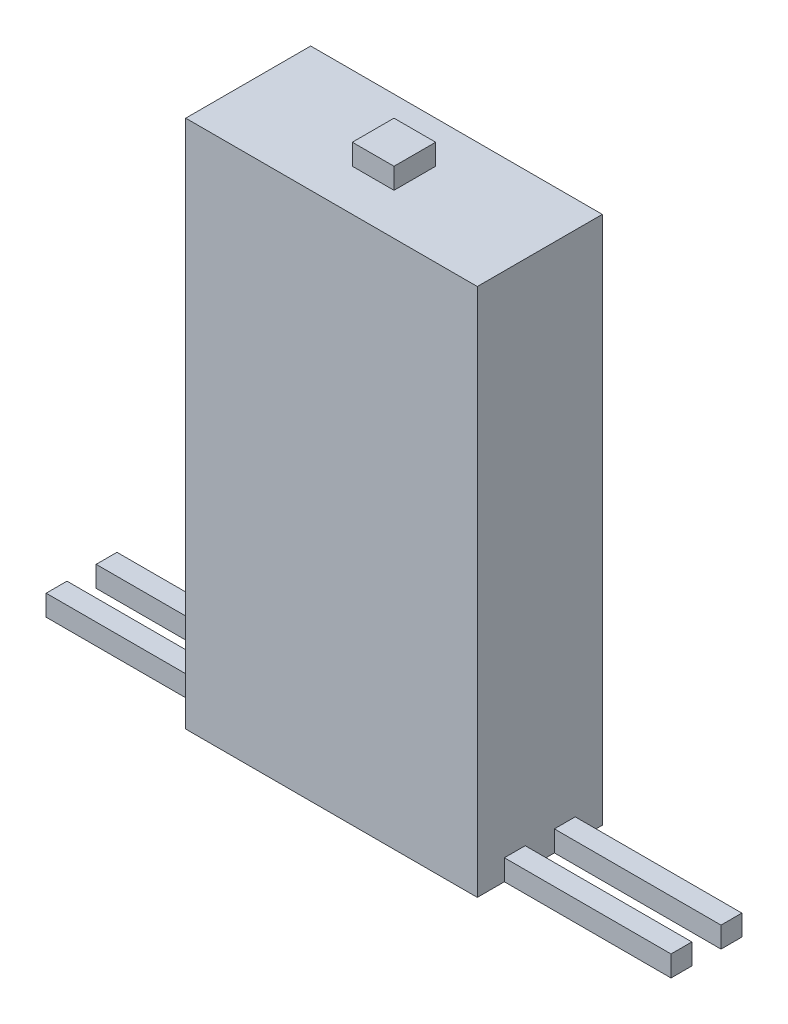
ISO-10303-21;
HEADER;
FILE_DESCRIPTION(('STEP AP214'),'2;1');
FILE_NAME('part.step','',(''),(''),'','','');
FILE_SCHEMA(('AUTOMOTIVE_DESIGN { 1 0 10303 214 1 1 1 1 }'));
ENDSEC;
DATA;
#1=APPLICATION_CONTEXT('core data for automotive mechanical design processes');
#2=APPLICATION_PROTOCOL_DEFINITION('international standard','automotive_design',2000,#1);
#3=PRODUCT_CONTEXT('',#1,'mechanical');
#4=PRODUCT('Part','Part','',(#3));
#5=PRODUCT_RELATED_PRODUCT_CATEGORY('part','',(#4));
#6=PRODUCT_DEFINITION_FORMATION('','',#4);
#7=PRODUCT_DEFINITION_CONTEXT('part definition',#1,'design');
#8=PRODUCT_DEFINITION('design','',#6,#7);
#9=PRODUCT_DEFINITION_SHAPE('','',#8);
#10=(LENGTH_UNIT() NAMED_UNIT(*) SI_UNIT(.MILLI.,.METRE.));
#11=(NAMED_UNIT(*) PLANE_ANGLE_UNIT() SI_UNIT($,.RADIAN.));
#12=(NAMED_UNIT(*) SI_UNIT($,.STERADIAN.) SOLID_ANGLE_UNIT());
#13=UNCERTAINTY_MEASURE_WITH_UNIT(LENGTH_MEASURE(1.E-05),#10,'distance_accuracy_value','');
#14=(GEOMETRIC_REPRESENTATION_CONTEXT(3) GLOBAL_UNCERTAINTY_ASSIGNED_CONTEXT((#13)) GLOBAL_UNIT_ASSIGNED_CONTEXT((#10,
#11,#12)) REPRESENTATION_CONTEXT('',''));
#15=CARTESIAN_POINT('',(0.,0.,0.));
#16=DIRECTION('',(0.,0.,1.));
#17=DIRECTION('',(1.,0.,0.));
#18=AXIS2_PLACEMENT_3D('',#15,#16,#17);
#19=CARTESIAN_POINT('',(0.,127.,0.));
#20=DIRECTION('',(0.,-1.,0.));
#21=DIRECTION('',(0.,0.,-1.));
#22=AXIS2_PLACEMENT_3D('',#19,#20,#21);
#23=PLANE('',#22);
#24=DIRECTION('',(0.,0.,-1.));
#25=VECTOR('',#24,1.);
#26=CARTESIAN_POINT('',(35.,127.,15.));
#27=LINE('',#26,#25);
#28=CARTESIAN_POINT('',(35.,127.,15.));
#29=VERTEX_POINT('',#28);
#30=CARTESIAN_POINT('',(35.,127.,-15.));
#31=VERTEX_POINT('',#30);
#32=EDGE_CURVE('E402',#29,#31,#27,.T.);
#33=ORIENTED_EDGE('',*,*,#32,.T.);
#34=DIRECTION('',(-1.,0.,0.));
#35=VECTOR('',#34,1.);
#36=CARTESIAN_POINT('',(-35.,127.,-15.));
#37=LINE('',#36,#35);
#38=CARTESIAN_POINT('',(-35.,127.,-15.));
#39=VERTEX_POINT('',#38);
#40=EDGE_CURVE('E406',#31,#39,#37,.T.);
#41=ORIENTED_EDGE('',*,*,#40,.T.);
#42=DIRECTION('',(0.,0.,1.));
#43=VECTOR('',#42,1.);
#44=CARTESIAN_POINT('',(-35.,127.,15.));
#45=LINE('',#44,#43);
#46=CARTESIAN_POINT('',(-35.,127.,15.));
#47=VERTEX_POINT('',#46);
#48=EDGE_CURVE('E410',#39,#47,#45,.T.);
#49=ORIENTED_EDGE('',*,*,#48,.T.);
#50=DIRECTION('',(1.,0.,0.));
#51=VECTOR('',#50,1.);
#52=CARTESIAN_POINT('',(-35.,127.,15.));
#53=LINE('',#52,#51);
#54=EDGE_CURVE('E413',#47,#29,#53,.T.);
#55=ORIENTED_EDGE('',*,*,#54,.T.);
#56=EDGE_LOOP('',(#33,#41,#49,#55));
#57=FACE_BOUND('',#56,.T.);
#58=DIRECTION('',(0.,0.,-1.));
#59=VECTOR('',#58,1.);
#60=CARTESIAN_POINT('',(5.,127.,5.));
#61=LINE('',#60,#59);
#62=CARTESIAN_POINT('',(5.,127.,5.));
#63=VERTEX_POINT('',#62);
#64=CARTESIAN_POINT('',(5.,127.,-5.));
#65=VERTEX_POINT('',#64);
#66=EDGE_CURVE('E229',#63,#65,#61,.T.);
#67=ORIENTED_EDGE('',*,*,#66,.F.);
#68=DIRECTION('',(1.,0.,0.));
#69=VECTOR('',#68,1.);
#70=CARTESIAN_POINT('',(-5.,127.,5.));
#71=LINE('',#70,#69);
#72=CARTESIAN_POINT('',(-5.,127.,5.));
#73=VERTEX_POINT('',#72);
#74=EDGE_CURVE('E226',#73,#63,#71,.T.);
#75=ORIENTED_EDGE('',*,*,#74,.F.);
#76=DIRECTION('',(0.,0.,1.));
#77=VECTOR('',#76,1.);
#78=CARTESIAN_POINT('',(-5.,127.,5.));
#79=LINE('',#78,#77);
#80=CARTESIAN_POINT('',(-5.,127.,-5.));
#81=VERTEX_POINT('',#80);
#82=EDGE_CURVE('E66',#81,#73,#79,.T.);
#83=ORIENTED_EDGE('',*,*,#82,.F.);
#84=DIRECTION('',(-1.,0.,0.));
#85=VECTOR('',#84,1.);
#86=CARTESIAN_POINT('',(-5.,127.,-5.));
#87=LINE('',#86,#85);
#88=EDGE_CURVE('E61',#65,#81,#87,.T.);
#89=ORIENTED_EDGE('',*,*,#88,.F.);
#90=EDGE_LOOP('',(#67,#75,#83,#89));
#91=FACE_BOUND('',#90,.T.);
#92=ADVANCED_FACE('F45',(#57,#91),#23,.F.);
#93=CARTESIAN_POINT('',(-35.,127.,15.));
#94=DIRECTION('',(1.,0.,0.));
#95=DIRECTION('',(0.,0.,-1.));
#96=AXIS2_PLACEMENT_3D('',#93,#94,#95);
#97=PLANE('',#96);
#98=DIRECTION('',(0.,1.,0.));
#99=VECTOR('',#98,1.);
#100=CARTESIAN_POINT('',(-35.,5.,-3.5));
#101=LINE('',#100,#99);
#102=CARTESIAN_POINT('',(-35.,0.,-3.5));
#103=VERTEX_POINT('',#102);
#104=CARTESIAN_POINT('',(-35.,5.,-3.5));
#105=VERTEX_POINT('',#104);
#106=EDGE_CURVE('E263',#103,#105,#101,.T.);
#107=ORIENTED_EDGE('',*,*,#106,.F.);
#108=DIRECTION('',(0.,0.,1.));
#109=VECTOR('',#108,1.);
#110=CARTESIAN_POINT('',(-35.,0.,15.));
#111=LINE('',#110,#109);
#112=CARTESIAN_POINT('',(-35.,0.,3.5));
#113=VERTEX_POINT('',#112);
#114=EDGE_CURVE('E428',#103,#113,#111,.T.);
#115=ORIENTED_EDGE('',*,*,#114,.T.);
#116=DIRECTION('',(0.,-1.,0.));
#117=VECTOR('',#116,1.);
#118=CARTESIAN_POINT('',(-35.,5.,3.5));
#119=LINE('',#118,#117);
#120=CARTESIAN_POINT('',(-35.,5.,3.5));
#121=VERTEX_POINT('',#120);
#122=EDGE_CURVE('E267',#121,#113,#119,.T.);
#123=ORIENTED_EDGE('',*,*,#122,.F.);
#124=DIRECTION('',(0.,0.,-1.));
#125=VECTOR('',#124,1.);
#126=CARTESIAN_POINT('',(-35.,5.,3.5));
#127=LINE('',#126,#125);
#128=CARTESIAN_POINT('',(-35.,5.,8.5));
#129=VERTEX_POINT('',#128);
#130=EDGE_CURVE('E284',#129,#121,#127,.T.);
#131=ORIENTED_EDGE('',*,*,#130,.F.);
#132=DIRECTION('',(0.,1.,0.));
#133=VECTOR('',#132,1.);
#134=CARTESIAN_POINT('',(-35.,5.,8.5));
#135=LINE('',#134,#133);
#136=CARTESIAN_POINT('',(-35.,0.,8.5));
#137=VERTEX_POINT('',#136);
#138=EDGE_CURVE('E297',#137,#129,#135,.T.);
#139=ORIENTED_EDGE('',*,*,#138,.F.);
#140=CARTESIAN_POINT('',(-35.,0.,15.));
#141=VERTEX_POINT('',#140);
#142=EDGE_CURVE('E424',#137,#141,#111,.T.);
#143=ORIENTED_EDGE('',*,*,#142,.T.);
#144=DIRECTION('',(0.,-1.,0.));
#145=VECTOR('',#144,1.);
#146=CARTESIAN_POINT('',(-35.,127.,15.));
#147=LINE('',#146,#145);
#148=EDGE_CURVE('E434',#47,#141,#147,.T.);
#149=ORIENTED_EDGE('',*,*,#148,.F.);
#150=ORIENTED_EDGE('',*,*,#48,.F.);
#151=DIRECTION('',(0.,-1.,0.));
#152=VECTOR('',#151,1.);
#153=CARTESIAN_POINT('',(-35.,127.,-15.));
#154=LINE('',#153,#152);
#155=CARTESIAN_POINT('',(-35.,0.,-15.));
#156=VERTEX_POINT('',#155);
#157=EDGE_CURVE('E54',#39,#156,#154,.T.);
#158=ORIENTED_EDGE('',*,*,#157,.T.);
#159=CARTESIAN_POINT('',(-35.,0.,-8.5));
#160=VERTEX_POINT('',#159);
#161=EDGE_CURVE('E425',#156,#160,#111,.T.);
#162=ORIENTED_EDGE('',*,*,#161,.T.);
#163=DIRECTION('',(0.,-1.,0.));
#164=VECTOR('',#163,1.);
#165=CARTESIAN_POINT('',(-35.,5.,-8.5));
#166=LINE('',#165,#164);
#167=CARTESIAN_POINT('',(-35.,4.99999999999999,-8.5));
#168=VERTEX_POINT('',#167);
#169=EDGE_CURVE('E254',#168,#160,#166,.T.);
#170=ORIENTED_EDGE('',*,*,#169,.F.);
#171=DIRECTION('',(0.,0.,-1.));
#172=VECTOR('',#171,1.);
#173=CARTESIAN_POINT('',(-35.,5.,-3.5));
#174=LINE('',#173,#172);
#175=EDGE_CURVE('E258',#105,#168,#174,.T.);
#176=ORIENTED_EDGE('',*,*,#175,.F.);
#177=EDGE_LOOP('',(#107,#115,#123,#131,#139,#143,#149,#150,#158,#162,#170,#176));
#178=FACE_BOUND('',#177,.T.);
#179=ADVANCED_FACE('F444',(#178),#97,.F.);
#180=CARTESIAN_POINT('',(35.,127.,15.));
#181=DIRECTION('',(-1.,0.,0.));
#182=DIRECTION('',(0.,0.,1.));
#183=AXIS2_PLACEMENT_3D('',#180,#181,#182);
#184=PLANE('',#183);
#185=DIRECTION('',(0.,1.,0.));
#186=VECTOR('',#185,1.);
#187=CARTESIAN_POINT('',(35.,5.,3.5));
#188=LINE('',#187,#186);
#189=CARTESIAN_POINT('',(35.,0.,3.5));
#190=VERTEX_POINT('',#189);
#191=CARTESIAN_POINT('',(35.,5.00000000000001,3.5));
#192=VERTEX_POINT('',#191);
#193=EDGE_CURVE('E345',#190,#192,#188,.T.);
#194=ORIENTED_EDGE('',*,*,#193,.F.);
#195=DIRECTION('',(0.,0.,-1.));
#196=VECTOR('',#195,1.);
#197=CARTESIAN_POINT('',(35.,0.,15.));
#198=LINE('',#197,#196);
#199=CARTESIAN_POINT('',(35.,0.,-3.5));
#200=VERTEX_POINT('',#199);
#201=EDGE_CURVE('E421',#190,#200,#198,.T.);
#202=ORIENTED_EDGE('',*,*,#201,.T.);
#203=DIRECTION('',(0.,-1.,0.));
#204=VECTOR('',#203,1.);
#205=CARTESIAN_POINT('',(35.,5.,-3.5));
#206=LINE('',#205,#204);
#207=CARTESIAN_POINT('',(35.,5.,-3.5));
#208=VERTEX_POINT('',#207);
#209=EDGE_CURVE('E349',#208,#200,#206,.T.);
#210=ORIENTED_EDGE('',*,*,#209,.F.);
#211=DIRECTION('',(0.,0.,1.));
#212=VECTOR('',#211,1.);
#213=CARTESIAN_POINT('',(35.,5.,-3.5));
#214=LINE('',#213,#212);
#215=CARTESIAN_POINT('',(35.,5.,-8.5));
#216=VERTEX_POINT('',#215);
#217=EDGE_CURVE('E366',#216,#208,#214,.T.);
#218=ORIENTED_EDGE('',*,*,#217,.F.);
#219=DIRECTION('',(0.,1.,0.));
#220=VECTOR('',#219,1.);
#221=CARTESIAN_POINT('',(35.,5.,-8.5));
#222=LINE('',#221,#220);
#223=CARTESIAN_POINT('',(35.,0.,-8.5));
#224=VERTEX_POINT('',#223);
#225=EDGE_CURVE('E379',#224,#216,#222,.T.);
#226=ORIENTED_EDGE('',*,*,#225,.F.);
#227=CARTESIAN_POINT('',(35.,0.,-15.));
#228=VERTEX_POINT('',#227);
#229=EDGE_CURVE('E401',#224,#228,#198,.T.);
#230=ORIENTED_EDGE('',*,*,#229,.T.);
#231=DIRECTION('',(0.,-1.,0.));
#232=VECTOR('',#231,1.);
#233=CARTESIAN_POINT('',(35.,127.,-15.));
#234=LINE('',#233,#232);
#235=EDGE_CURVE('E11',#31,#228,#234,.T.);
#236=ORIENTED_EDGE('',*,*,#235,.F.);
#237=ORIENTED_EDGE('',*,*,#32,.F.);
#238=DIRECTION('',(0.,-1.,0.));
#239=VECTOR('',#238,1.);
#240=CARTESIAN_POINT('',(35.,127.,15.));
#241=LINE('',#240,#239);
#242=CARTESIAN_POINT('',(35.,0.,15.));
#243=VERTEX_POINT('',#242);
#244=EDGE_CURVE('E416',#29,#243,#241,.T.);
#245=ORIENTED_EDGE('',*,*,#244,.T.);
#246=CARTESIAN_POINT('',(35.,0.,8.5));
#247=VERTEX_POINT('',#246);
#248=EDGE_CURVE('E417',#243,#247,#198,.T.);
#249=ORIENTED_EDGE('',*,*,#248,.T.);
#250=DIRECTION('',(0.,-1.,0.));
#251=VECTOR('',#250,1.);
#252=CARTESIAN_POINT('',(35.,5.,8.5));
#253=LINE('',#252,#251);
#254=CARTESIAN_POINT('',(35.,5.,8.5));
#255=VERTEX_POINT('',#254);
#256=EDGE_CURVE('E336',#255,#247,#253,.T.);
#257=ORIENTED_EDGE('',*,*,#256,.F.);
#258=DIRECTION('',(0.,0.,1.));
#259=VECTOR('',#258,1.);
#260=CARTESIAN_POINT('',(35.,5.,3.5));
#261=LINE('',#260,#259);
#262=EDGE_CURVE('E340',#192,#255,#261,.T.);
#263=ORIENTED_EDGE('',*,*,#262,.F.);
#264=EDGE_LOOP('',(#194,#202,#210,#218,#226,#230,#236,#237,#245,#249,#257,#263));
#265=FACE_BOUND('',#264,.T.);
#266=ADVANCED_FACE('F47',(#265),#184,.F.);
#267=CARTESIAN_POINT('',(-35.,127.,-15.));
#268=DIRECTION('',(0.,0.,1.));
#269=DIRECTION('',(1.,0.,0.));
#270=AXIS2_PLACEMENT_3D('',#267,#268,#269);
#271=PLANE('',#270);
#272=DIRECTION('',(-1.,0.,0.));
#273=VECTOR('',#272,1.);
#274=CARTESIAN_POINT('',(-35.,0.,-15.));
#275=LINE('',#274,#273);
#276=EDGE_CURVE('E420',#228,#156,#275,.T.);
#277=ORIENTED_EDGE('',*,*,#276,.T.);
#278=ORIENTED_EDGE('',*,*,#157,.F.);
#279=ORIENTED_EDGE('',*,*,#40,.F.);
#280=ORIENTED_EDGE('',*,*,#235,.T.);
#281=EDGE_LOOP('',(#277,#278,#279,#280));
#282=FACE_BOUND('',#281,.T.);
#283=ADVANCED_FACE('F529',(#282),#271,.F.);
#284=CARTESIAN_POINT('',(-35.,127.,15.));
#285=DIRECTION('',(0.,0.,-1.));
#286=DIRECTION('',(-1.,0.,0.));
#287=AXIS2_PLACEMENT_3D('',#284,#285,#286);
#288=PLANE('',#287);
#289=DIRECTION('',(1.,0.,0.));
#290=VECTOR('',#289,1.);
#291=CARTESIAN_POINT('',(-35.,0.,15.));
#292=LINE('',#291,#290);
#293=EDGE_CURVE('E407',#141,#243,#292,.T.);
#294=ORIENTED_EDGE('',*,*,#293,.T.);
#295=ORIENTED_EDGE('',*,*,#244,.F.);
#296=ORIENTED_EDGE('',*,*,#54,.F.);
#297=ORIENTED_EDGE('',*,*,#148,.T.);
#298=EDGE_LOOP('',(#294,#295,#296,#297));
#299=FACE_BOUND('',#298,.T.);
#300=ADVANCED_FACE('F526',(#299),#288,.F.);
#301=CARTESIAN_POINT('',(0.,0.,0.));
#302=DIRECTION('',(0.,-1.,0.));
#303=DIRECTION('',(0.,0.,-1.));
#304=AXIS2_PLACEMENT_3D('',#301,#302,#303);
#305=PLANE('',#304);
#306=CARTESIAN_POINT('',(0.,0.,0.));
#307=DIRECTION('',(0.,-1.,0.));
#308=DIRECTION('',(0.,0.,-1.));
#309=AXIS2_PLACEMENT_3D('',#306,#307,#308);
#310=CIRCLE('',#309,6.);
#311=CARTESIAN_POINT('',(0.,0.,-6.));
#312=VERTEX_POINT('',#311);
#313=EDGE_CURVE('E606',#312,#312,#310,.T.);
#314=ORIENTED_EDGE('',*,*,#313,.F.);
#315=EDGE_LOOP('',(#314));
#316=FACE_BOUND('',#315,.T.);
#317=ORIENTED_EDGE('',*,*,#248,.F.);
#318=ORIENTED_EDGE('',*,*,#293,.F.);
#319=ORIENTED_EDGE('',*,*,#142,.F.);
#320=DIRECTION('',(1.,0.,0.));
#321=VECTOR('',#320,1.);
#322=CARTESIAN_POINT('',(-75.,0.,8.5));
#323=LINE('',#322,#321);
#324=CARTESIAN_POINT('',(-75.,0.,8.5));
#325=VERTEX_POINT('',#324);
#326=EDGE_CURVE('E311',#325,#137,#323,.T.);
#327=ORIENTED_EDGE('',*,*,#326,.F.);
#328=DIRECTION('',(0.,0.,1.));
#329=VECTOR('',#328,1.);
#330=CARTESIAN_POINT('',(-75.,0.,3.5));
#331=LINE('',#330,#329);
#332=CARTESIAN_POINT('',(-75.,0.,3.5));
#333=VERTEX_POINT('',#332);
#334=EDGE_CURVE('E283',#333,#325,#331,.T.);
#335=ORIENTED_EDGE('',*,*,#334,.F.);
#336=DIRECTION('',(1.,0.,0.));
#337=VECTOR('',#336,1.);
#338=CARTESIAN_POINT('',(-75.,0.,3.5));
#339=LINE('',#338,#337);
#340=EDGE_CURVE('E315',#333,#113,#339,.T.);
#341=ORIENTED_EDGE('',*,*,#340,.T.);
#342=ORIENTED_EDGE('',*,*,#114,.F.);
#343=DIRECTION('',(1.,0.,0.));
#344=VECTOR('',#343,1.);
#345=CARTESIAN_POINT('',(-75.,0.,-3.5));
#346=LINE('',#345,#344);
#347=CARTESIAN_POINT('',(-75.,0.,-3.5));
#348=VERTEX_POINT('',#347);
#349=EDGE_CURVE('E231',#348,#103,#346,.T.);
#350=ORIENTED_EDGE('',*,*,#349,.F.);
#351=DIRECTION('',(0.,0.,1.));
#352=VECTOR('',#351,1.);
#353=CARTESIAN_POINT('',(-75.,0.,-3.5));
#354=LINE('',#353,#352);
#355=CARTESIAN_POINT('',(-75.,0.,-8.5));
#356=VERTEX_POINT('',#355);
#357=EDGE_CURVE('E259',#356,#348,#354,.T.);
#358=ORIENTED_EDGE('',*,*,#357,.F.);
#359=DIRECTION('',(1.,0.,0.));
#360=VECTOR('',#359,1.);
#361=CARTESIAN_POINT('',(-75.,0.,-8.5));
#362=LINE('',#361,#360);
#363=EDGE_CURVE('E249',#356,#160,#362,.T.);
#364=ORIENTED_EDGE('',*,*,#363,.T.);
#365=ORIENTED_EDGE('',*,*,#161,.F.);
#366=ORIENTED_EDGE('',*,*,#276,.F.);
#367=ORIENTED_EDGE('',*,*,#229,.F.);
#368=DIRECTION('',(-1.,0.,0.));
#369=VECTOR('',#368,1.);
#370=CARTESIAN_POINT('',(75.,0.,-8.5));
#371=LINE('',#370,#369);
#372=CARTESIAN_POINT('',(75.,0.,-8.5));
#373=VERTEX_POINT('',#372);
#374=EDGE_CURVE('E393',#373,#224,#371,.T.);
#375=ORIENTED_EDGE('',*,*,#374,.F.);
#376=DIRECTION('',(0.,0.,-1.));
#377=VECTOR('',#376,1.);
#378=CARTESIAN_POINT('',(75.,0.,-3.5));
#379=LINE('',#378,#377);
#380=CARTESIAN_POINT('',(75.,0.,-3.5));
#381=VERTEX_POINT('',#380);
#382=EDGE_CURVE('E365',#381,#373,#379,.T.);
#383=ORIENTED_EDGE('',*,*,#382,.F.);
#384=DIRECTION('',(-1.,0.,0.));
#385=VECTOR('',#384,1.);
#386=CARTESIAN_POINT('',(75.,0.,-3.5));
#387=LINE('',#386,#385);
#388=EDGE_CURVE('E397',#381,#200,#387,.T.);
#389=ORIENTED_EDGE('',*,*,#388,.T.);
#390=ORIENTED_EDGE('',*,*,#201,.F.);
#391=DIRECTION('',(-1.,0.,0.));
#392=VECTOR('',#391,1.);
#393=CARTESIAN_POINT('',(75.,0.,3.5));
#394=LINE('',#393,#392);
#395=CARTESIAN_POINT('',(75.,0.,3.5));
#396=VERTEX_POINT('',#395);
#397=EDGE_CURVE('E319',#396,#190,#394,.T.);
#398=ORIENTED_EDGE('',*,*,#397,.F.);
#399=DIRECTION('',(0.,0.,-1.));
#400=VECTOR('',#399,1.);
#401=CARTESIAN_POINT('',(75.,0.,3.5));
#402=LINE('',#401,#400);
#403=CARTESIAN_POINT('',(75.,0.,8.5));
#404=VERTEX_POINT('',#403);
#405=EDGE_CURVE('E341',#404,#396,#402,.T.);
#406=ORIENTED_EDGE('',*,*,#405,.F.);
#407=DIRECTION('',(-1.,0.,0.));
#408=VECTOR('',#407,1.);
#409=CARTESIAN_POINT('',(75.,0.,8.5));
#410=LINE('',#409,#408);
#411=EDGE_CURVE('E331',#404,#247,#410,.T.);
#412=ORIENTED_EDGE('',*,*,#411,.T.);
#413=EDGE_LOOP('',(#317,#318,#319,#327,#335,#341,#342,#350,#358,#364,#365,#366,#367,#375,#383,
#389,#390,#398,#406,#412));
#414=FACE_BOUND('',#413,.T.);
#415=ADVANCED_FACE('F450',(#316,#414),#305,.T.);
#416=CARTESIAN_POINT('',(75.,5.,-3.5));
#417=DIRECTION('',(0.,0.,-1.));
#418=DIRECTION('',(-1.,0.,0.));
#419=AXIS2_PLACEMENT_3D('',#416,#417,#418);
#420=PLANE('',#419);
#421=ORIENTED_EDGE('',*,*,#209,.T.);
#422=ORIENTED_EDGE('',*,*,#388,.F.);
#423=DIRECTION('',(0.,-1.,0.));
#424=VECTOR('',#423,1.);
#425=CARTESIAN_POINT('',(75.,5.,-3.5));
#426=LINE('',#425,#424);
#427=CARTESIAN_POINT('',(75.,5.,-3.5));
#428=VERTEX_POINT('',#427);
#429=EDGE_CURVE('E361',#428,#381,#426,.T.);
#430=ORIENTED_EDGE('',*,*,#429,.F.);
#431=DIRECTION('',(-1.,0.,0.));
#432=VECTOR('',#431,1.);
#433=CARTESIAN_POINT('',(75.,5.,-3.5));
#434=LINE('',#433,#432);
#435=EDGE_CURVE('E375',#428,#208,#434,.T.);
#436=ORIENTED_EDGE('',*,*,#435,.T.);
#437=EDGE_LOOP('',(#421,#422,#430,#436));
#438=FACE_BOUND('',#437,.T.);
#439=ADVANCED_FACE('F501',(#438),#420,.F.);
#440=CARTESIAN_POINT('',(75.,5.,-8.5));
#441=DIRECTION('',(0.,0.,1.));
#442=DIRECTION('',(0.,-1.,0.));
#443=AXIS2_PLACEMENT_3D('',#440,#441,#442);
#444=PLANE('',#443);
#445=ORIENTED_EDGE('',*,*,#225,.T.);
#446=DIRECTION('',(-1.,0.,0.));
#447=VECTOR('',#446,1.);
#448=CARTESIAN_POINT('',(75.,5.,-8.5));
#449=LINE('',#448,#447);
#450=CARTESIAN_POINT('',(75.,5.,-8.5));
#451=VERTEX_POINT('',#450);
#452=EDGE_CURVE('E389',#451,#216,#449,.T.);
#453=ORIENTED_EDGE('',*,*,#452,.F.);
#454=DIRECTION('',(0.,1.,0.));
#455=VECTOR('',#454,1.);
#456=CARTESIAN_POINT('',(75.,5.,-8.5));
#457=LINE('',#456,#455);
#458=EDGE_CURVE('E369',#373,#451,#457,.T.);
#459=ORIENTED_EDGE('',*,*,#458,.F.);
#460=ORIENTED_EDGE('',*,*,#374,.T.);
#461=EDGE_LOOP('',(#445,#453,#459,#460));
#462=FACE_BOUND('',#461,.T.);
#463=ADVANCED_FACE('F491',(#462),#444,.F.);
#464=CARTESIAN_POINT('',(75.,5.,-3.5));
#465=DIRECTION('',(0.,-1.,0.));
#466=DIRECTION('',(0.,0.,-1.));
#467=AXIS2_PLACEMENT_3D('',#464,#465,#466);
#468=PLANE('',#467);
#469=ORIENTED_EDGE('',*,*,#217,.T.);
#470=ORIENTED_EDGE('',*,*,#435,.F.);
#471=DIRECTION('',(0.,0.,1.));
#472=VECTOR('',#471,1.);
#473=CARTESIAN_POINT('',(75.,5.,-3.5));
#474=LINE('',#473,#472);
#475=EDGE_CURVE('E372',#451,#428,#474,.T.);
#476=ORIENTED_EDGE('',*,*,#475,.F.);
#477=ORIENTED_EDGE('',*,*,#452,.T.);
#478=EDGE_LOOP('',(#469,#470,#476,#477));
#479=FACE_BOUND('',#478,.T.);
#480=ADVANCED_FACE('F503',(#479),#468,.F.);
#481=CARTESIAN_POINT('',(75.,0.,0.));
#482=DIRECTION('',(1.,0.,0.));
#483=DIRECTION('',(0.,0.,-1.));
#484=AXIS2_PLACEMENT_3D('',#481,#482,#483);
#485=PLANE('',#484);
#486=ORIENTED_EDGE('',*,*,#429,.T.);
#487=ORIENTED_EDGE('',*,*,#382,.T.);
#488=ORIENTED_EDGE('',*,*,#458,.T.);
#489=ORIENTED_EDGE('',*,*,#475,.T.);
#490=EDGE_LOOP('',(#486,#487,#488,#489));
#491=FACE_BOUND('',#490,.T.);
#492=ADVANCED_FACE('F495',(#491),#485,.T.);
#493=CARTESIAN_POINT('',(75.,5.,3.5));
#494=DIRECTION('',(0.,0.,1.));
#495=DIRECTION('',(1.,0.,0.));
#496=AXIS2_PLACEMENT_3D('',#493,#494,#495);
#497=PLANE('',#496);
#498=ORIENTED_EDGE('',*,*,#193,.T.);
#499=DIRECTION('',(-1.,0.,0.));
#500=VECTOR('',#499,1.);
#501=CARTESIAN_POINT('',(75.,5.,3.5));
#502=LINE('',#501,#500);
#503=CARTESIAN_POINT('',(75.,5.,3.5));
#504=VERTEX_POINT('',#503);
#505=EDGE_CURVE('E323',#504,#192,#502,.T.);
#506=ORIENTED_EDGE('',*,*,#505,.F.);
#507=DIRECTION('',(0.,1.,0.));
#508=VECTOR('',#507,1.);
#509=CARTESIAN_POINT('',(75.,5.,3.5));
#510=LINE('',#509,#508);
#511=EDGE_CURVE('E355',#396,#504,#510,.T.);
#512=ORIENTED_EDGE('',*,*,#511,.F.);
#513=ORIENTED_EDGE('',*,*,#397,.T.);
#514=EDGE_LOOP('',(#498,#506,#512,#513));
#515=FACE_BOUND('',#514,.T.);
#516=ADVANCED_FACE('F510',(#515),#497,.F.);
#517=CARTESIAN_POINT('',(75.,5.,3.5));
#518=DIRECTION('',(0.,-1.,0.));
#519=DIRECTION('',(0.,0.,-1.));
#520=AXIS2_PLACEMENT_3D('',#517,#518,#519);
#521=PLANE('',#520);
#522=ORIENTED_EDGE('',*,*,#262,.T.);
#523=DIRECTION('',(-1.,0.,0.));
#524=VECTOR('',#523,1.);
#525=CARTESIAN_POINT('',(75.,5.,8.5));
#526=LINE('',#525,#524);
#527=CARTESIAN_POINT('',(75.,5.,8.5));
#528=VERTEX_POINT('',#527);
#529=EDGE_CURVE('E327',#528,#255,#526,.T.);
#530=ORIENTED_EDGE('',*,*,#529,.F.);
#531=DIRECTION('',(0.,0.,1.));
#532=VECTOR('',#531,1.);
#533=CARTESIAN_POINT('',(75.,5.,3.5));
#534=LINE('',#533,#532);
#535=EDGE_CURVE('E352',#504,#528,#534,.T.);
#536=ORIENTED_EDGE('',*,*,#535,.F.);
#537=ORIENTED_EDGE('',*,*,#505,.T.);
#538=EDGE_LOOP('',(#522,#530,#536,#537));
#539=FACE_BOUND('',#538,.T.);
#540=ADVANCED_FACE('F544',(#539),#521,.F.);
#541=CARTESIAN_POINT('',(75.,5.,8.5));
#542=DIRECTION('',(0.,0.,-1.));
#543=DIRECTION('',(0.,1.,0.));
#544=AXIS2_PLACEMENT_3D('',#541,#542,#543);
#545=PLANE('',#544);
#546=ORIENTED_EDGE('',*,*,#256,.T.);
#547=ORIENTED_EDGE('',*,*,#411,.F.);
#548=DIRECTION('',(0.,-1.,0.));
#549=VECTOR('',#548,1.);
#550=CARTESIAN_POINT('',(75.,5.,8.5));
#551=LINE('',#550,#549);
#552=EDGE_CURVE('E335',#528,#404,#551,.T.);
#553=ORIENTED_EDGE('',*,*,#552,.F.);
#554=ORIENTED_EDGE('',*,*,#529,.T.);
#555=EDGE_LOOP('',(#546,#547,#553,#554));
#556=FACE_BOUND('',#555,.T.);
#557=ADVANCED_FACE('F541',(#556),#545,.F.);
#558=CARTESIAN_POINT('',(75.,0.,0.));
#559=DIRECTION('',(1.,0.,0.));
#560=DIRECTION('',(0.,0.,-1.));
#561=AXIS2_PLACEMENT_3D('',#558,#559,#560);
#562=PLANE('',#561);
#563=ORIENTED_EDGE('',*,*,#405,.T.);
#564=ORIENTED_EDGE('',*,*,#511,.T.);
#565=ORIENTED_EDGE('',*,*,#535,.T.);
#566=ORIENTED_EDGE('',*,*,#552,.T.);
#567=EDGE_LOOP('',(#563,#564,#565,#566));
#568=FACE_BOUND('',#567,.T.);
#569=ADVANCED_FACE('F549',(#568),#562,.T.);
#570=CARTESIAN_POINT('',(-75.,5.,3.5));
#571=DIRECTION('',(0.,0.,1.));
#572=DIRECTION('',(1.,0.,0.));
#573=AXIS2_PLACEMENT_3D('',#570,#571,#572);
#574=PLANE('',#573);
#575=ORIENTED_EDGE('',*,*,#122,.T.);
#576=ORIENTED_EDGE('',*,*,#340,.F.);
#577=DIRECTION('',(0.,-1.,0.));
#578=VECTOR('',#577,1.);
#579=CARTESIAN_POINT('',(-75.,5.,3.5));
#580=LINE('',#579,#578);
#581=CARTESIAN_POINT('',(-75.,5.,3.5));
#582=VERTEX_POINT('',#581);
#583=EDGE_CURVE('E279',#582,#333,#580,.T.);
#584=ORIENTED_EDGE('',*,*,#583,.F.);
#585=DIRECTION('',(1.,0.,0.));
#586=VECTOR('',#585,1.);
#587=CARTESIAN_POINT('',(-75.,5.,3.5));
#588=LINE('',#587,#586);
#589=EDGE_CURVE('E293',#582,#121,#588,.T.);
#590=ORIENTED_EDGE('',*,*,#589,.T.);
#591=EDGE_LOOP('',(#575,#576,#584,#590));
#592=FACE_BOUND('',#591,.T.);
#593=ADVANCED_FACE('F470',(#592),#574,.F.);
#594=CARTESIAN_POINT('',(-75.,5.,8.5));
#595=DIRECTION('',(0.,0.,-1.));
#596=DIRECTION('',(-1.,0.,0.));
#597=AXIS2_PLACEMENT_3D('',#594,#595,#596);
#598=PLANE('',#597);
#599=ORIENTED_EDGE('',*,*,#138,.T.);
#600=DIRECTION('',(1.,0.,0.));
#601=VECTOR('',#600,1.);
#602=CARTESIAN_POINT('',(-75.,5.,8.5));
#603=LINE('',#602,#601);
#604=CARTESIAN_POINT('',(-75.,5.,8.5));
#605=VERTEX_POINT('',#604);
#606=EDGE_CURVE('E307',#605,#129,#603,.T.);
#607=ORIENTED_EDGE('',*,*,#606,.F.);
#608=DIRECTION('',(0.,1.,0.));
#609=VECTOR('',#608,1.);
#610=CARTESIAN_POINT('',(-75.,5.,8.5));
#611=LINE('',#610,#609);
#612=EDGE_CURVE('E287',#325,#605,#611,.T.);
#613=ORIENTED_EDGE('',*,*,#612,.F.);
#614=ORIENTED_EDGE('',*,*,#326,.T.);
#615=EDGE_LOOP('',(#599,#607,#613,#614));
#616=FACE_BOUND('',#615,.T.);
#617=ADVANCED_FACE('F478',(#616),#598,.F.);
#618=CARTESIAN_POINT('',(-75.,5.,3.5));
#619=DIRECTION('',(0.,-1.,0.));
#620=DIRECTION('',(0.,0.,-1.));
#621=AXIS2_PLACEMENT_3D('',#618,#619,#620);
#622=PLANE('',#621);
#623=ORIENTED_EDGE('',*,*,#130,.T.);
#624=ORIENTED_EDGE('',*,*,#589,.F.);
#625=DIRECTION('',(0.,0.,-1.));
#626=VECTOR('',#625,1.);
#627=CARTESIAN_POINT('',(-75.,5.,3.5));
#628=LINE('',#627,#626);
#629=EDGE_CURVE('E290',#605,#582,#628,.T.);
#630=ORIENTED_EDGE('',*,*,#629,.F.);
#631=ORIENTED_EDGE('',*,*,#606,.T.);
#632=EDGE_LOOP('',(#623,#624,#630,#631));
#633=FACE_BOUND('',#632,.T.);
#634=ADVANCED_FACE('F474',(#633),#622,.F.);
#635=CARTESIAN_POINT('',(-75.,0.,0.));
#636=DIRECTION('',(-1.,0.,0.));
#637=DIRECTION('',(0.,0.,1.));
#638=AXIS2_PLACEMENT_3D('',#635,#636,#637);
#639=PLANE('',#638);
#640=ORIENTED_EDGE('',*,*,#583,.T.);
#641=ORIENTED_EDGE('',*,*,#334,.T.);
#642=ORIENTED_EDGE('',*,*,#612,.T.);
#643=ORIENTED_EDGE('',*,*,#629,.T.);
#644=EDGE_LOOP('',(#640,#641,#642,#643));
#645=FACE_BOUND('',#644,.T.);
#646=ADVANCED_FACE('F567',(#645),#639,.T.);
#647=CARTESIAN_POINT('',(-75.,5.,-3.5));
#648=DIRECTION('',(0.,0.,-1.));
#649=DIRECTION('',(-1.,0.,0.));
#650=AXIS2_PLACEMENT_3D('',#647,#648,#649);
#651=PLANE('',#650);
#652=ORIENTED_EDGE('',*,*,#106,.T.);
#653=DIRECTION('',(1.,0.,0.));
#654=VECTOR('',#653,1.);
#655=CARTESIAN_POINT('',(-75.,5.,-3.5));
#656=LINE('',#655,#654);
#657=CARTESIAN_POINT('',(-75.,5.,-3.5));
#658=VERTEX_POINT('',#657);
#659=EDGE_CURVE('E236',#658,#105,#656,.T.);
#660=ORIENTED_EDGE('',*,*,#659,.F.);
#661=DIRECTION('',(0.,1.,0.));
#662=VECTOR('',#661,1.);
#663=CARTESIAN_POINT('',(-75.,5.,-3.5));
#664=LINE('',#663,#662);
#665=EDGE_CURVE('E273',#348,#658,#664,.T.);
#666=ORIENTED_EDGE('',*,*,#665,.F.);
#667=ORIENTED_EDGE('',*,*,#349,.T.);
#668=EDGE_LOOP('',(#652,#660,#666,#667));
#669=FACE_BOUND('',#668,.T.);
#670=ADVANCED_FACE('F464',(#669),#651,.F.);
#671=CARTESIAN_POINT('',(-75.,5.,-3.5));
#672=DIRECTION('',(0.,-1.,0.));
#673=DIRECTION('',(0.,0.,-1.));
#674=AXIS2_PLACEMENT_3D('',#671,#672,#673);
#675=PLANE('',#674);
#676=ORIENTED_EDGE('',*,*,#175,.T.);
#677=DIRECTION('',(1.,0.,0.));
#678=VECTOR('',#677,1.);
#679=CARTESIAN_POINT('',(-75.,5.,-8.5));
#680=LINE('',#679,#678);
#681=CARTESIAN_POINT('',(-75.,5.,-8.5));
#682=VERTEX_POINT('',#681);
#683=EDGE_CURVE('E245',#682,#168,#680,.T.);
#684=ORIENTED_EDGE('',*,*,#683,.F.);
#685=DIRECTION('',(0.,0.,-1.));
#686=VECTOR('',#685,1.);
#687=CARTESIAN_POINT('',(-75.,5.,-3.5));
#688=LINE('',#687,#686);
#689=EDGE_CURVE('E270',#658,#682,#688,.T.);
#690=ORIENTED_EDGE('',*,*,#689,.F.);
#691=ORIENTED_EDGE('',*,*,#659,.T.);
#692=EDGE_LOOP('',(#676,#684,#690,#691));
#693=FACE_BOUND('',#692,.T.);
#694=ADVANCED_FACE('F460',(#693),#675,.F.);
#695=CARTESIAN_POINT('',(-75.,5.,-8.5));
#696=DIRECTION('',(0.,0.,1.));
#697=DIRECTION('',(1.,0.,0.));
#698=AXIS2_PLACEMENT_3D('',#695,#696,#697);
#699=PLANE('',#698);
#700=ORIENTED_EDGE('',*,*,#169,.T.);
#701=ORIENTED_EDGE('',*,*,#363,.F.);
#702=DIRECTION('',(0.,-1.,0.));
#703=VECTOR('',#702,1.);
#704=CARTESIAN_POINT('',(-75.,5.,-8.5));
#705=LINE('',#704,#703);
#706=EDGE_CURVE('E253',#682,#356,#705,.T.);
#707=ORIENTED_EDGE('',*,*,#706,.F.);
#708=ORIENTED_EDGE('',*,*,#683,.T.);
#709=EDGE_LOOP('',(#700,#701,#707,#708));
#710=FACE_BOUND('',#709,.T.);
#711=ADVANCED_FACE('F457',(#710),#699,.F.);
#712=CARTESIAN_POINT('',(-75.,0.,0.));
#713=DIRECTION('',(-1.,0.,0.));
#714=DIRECTION('',(0.,0.,1.));
#715=AXIS2_PLACEMENT_3D('',#712,#713,#714);
#716=PLANE('',#715);
#717=ORIENTED_EDGE('',*,*,#357,.T.);
#718=ORIENTED_EDGE('',*,*,#665,.T.);
#719=ORIENTED_EDGE('',*,*,#689,.T.);
#720=ORIENTED_EDGE('',*,*,#706,.T.);
#721=EDGE_LOOP('',(#717,#718,#719,#720));
#722=FACE_BOUND('',#721,.T.);
#723=ADVANCED_FACE('F571',(#722),#716,.T.);
#724=CARTESIAN_POINT('',(5.,132.,5.));
#725=DIRECTION('',(-1.,0.,0.));
#726=DIRECTION('',(0.,0.,1.));
#727=AXIS2_PLACEMENT_3D('',#724,#725,#726);
#728=PLANE('',#727);
#729=ORIENTED_EDGE('',*,*,#66,.T.);
#730=DIRECTION('',(0.,-1.,0.));
#731=VECTOR('',#730,1.);
#732=CARTESIAN_POINT('',(5.,132.,-5.));
#733=LINE('',#732,#731);
#734=CARTESIAN_POINT('',(5.,132.,-5.));
#735=VERTEX_POINT('',#734);
#736=EDGE_CURVE('E208',#735,#65,#733,.T.);
#737=ORIENTED_EDGE('',*,*,#736,.F.);
#738=DIRECTION('',(0.,0.,-1.));
#739=VECTOR('',#738,1.);
#740=CARTESIAN_POINT('',(5.,132.,5.));
#741=LINE('',#740,#739);
#742=CARTESIAN_POINT('',(5.,132.,5.));
#743=VERTEX_POINT('',#742);
#744=EDGE_CURVE('E216',#743,#735,#741,.T.);
#745=ORIENTED_EDGE('',*,*,#744,.F.);
#746=DIRECTION('',(0.,-1.,0.));
#747=VECTOR('',#746,1.);
#748=CARTESIAN_POINT('',(5.,132.,5.));
#749=LINE('',#748,#747);
#750=EDGE_CURVE('E617',#743,#63,#749,.T.);
#751=ORIENTED_EDGE('',*,*,#750,.T.);
#752=EDGE_LOOP('',(#729,#737,#745,#751));
#753=FACE_BOUND('',#752,.T.);
#754=ADVANCED_FACE('F228',(#753),#728,.F.);
#755=CARTESIAN_POINT('',(-5.,132.,-5.));
#756=DIRECTION('',(0.,0.,1.));
#757=DIRECTION('',(1.,0.,0.));
#758=AXIS2_PLACEMENT_3D('',#755,#756,#757);
#759=PLANE('',#758);
#760=ORIENTED_EDGE('',*,*,#88,.T.);
#761=DIRECTION('',(0.,-1.,0.));
#762=VECTOR('',#761,1.);
#763=CARTESIAN_POINT('',(-5.,132.,-5.));
#764=LINE('',#763,#762);
#765=CARTESIAN_POINT('',(-5.,132.,-5.));
#766=VERTEX_POINT('',#765);
#767=EDGE_CURVE('E211',#766,#81,#764,.T.);
#768=ORIENTED_EDGE('',*,*,#767,.F.);
#769=DIRECTION('',(-1.,0.,0.));
#770=VECTOR('',#769,1.);
#771=CARTESIAN_POINT('',(-5.,132.,-5.));
#772=LINE('',#771,#770);
#773=EDGE_CURVE('E204',#735,#766,#772,.T.);
#774=ORIENTED_EDGE('',*,*,#773,.F.);
#775=ORIENTED_EDGE('',*,*,#736,.T.);
#776=EDGE_LOOP('',(#760,#768,#774,#775));
#777=FACE_BOUND('',#776,.T.);
#778=ADVANCED_FACE('F206',(#777),#759,.F.);
#779=CARTESIAN_POINT('',(-5.,132.,5.));
#780=DIRECTION('',(1.,0.,0.));
#781=DIRECTION('',(0.,0.,-1.));
#782=AXIS2_PLACEMENT_3D('',#779,#780,#781);
#783=PLANE('',#782);
#784=ORIENTED_EDGE('',*,*,#82,.T.);
#785=DIRECTION('',(0.,-1.,0.));
#786=VECTOR('',#785,1.);
#787=CARTESIAN_POINT('',(-5.,132.,5.));
#788=LINE('',#787,#786);
#789=CARTESIAN_POINT('',(-5.,132.,5.));
#790=VERTEX_POINT('',#789);
#791=EDGE_CURVE('E238',#790,#73,#788,.T.);
#792=ORIENTED_EDGE('',*,*,#791,.F.);
#793=DIRECTION('',(0.,0.,1.));
#794=VECTOR('',#793,1.);
#795=CARTESIAN_POINT('',(-5.,132.,5.));
#796=LINE('',#795,#794);
#797=EDGE_CURVE('E215',#766,#790,#796,.T.);
#798=ORIENTED_EDGE('',*,*,#797,.F.);
#799=ORIENTED_EDGE('',*,*,#767,.T.);
#800=EDGE_LOOP('',(#784,#792,#798,#799));
#801=FACE_BOUND('',#800,.T.);
#802=ADVANCED_FACE('F583',(#801),#783,.F.);
#803=CARTESIAN_POINT('',(-5.,132.,5.));
#804=DIRECTION('',(0.,0.,-1.));
#805=DIRECTION('',(-1.,0.,0.));
#806=AXIS2_PLACEMENT_3D('',#803,#804,#805);
#807=PLANE('',#806);
#808=ORIENTED_EDGE('',*,*,#74,.T.);
#809=ORIENTED_EDGE('',*,*,#750,.F.);
#810=DIRECTION('',(1.,0.,0.));
#811=VECTOR('',#810,1.);
#812=CARTESIAN_POINT('',(-5.,132.,5.));
#813=LINE('',#812,#811);
#814=EDGE_CURVE('E221',#790,#743,#813,.T.);
#815=ORIENTED_EDGE('',*,*,#814,.F.);
#816=ORIENTED_EDGE('',*,*,#791,.T.);
#817=EDGE_LOOP('',(#808,#809,#815,#816));
#818=FACE_BOUND('',#817,.T.);
#819=ADVANCED_FACE('F586',(#818),#807,.F.);
#820=CARTESIAN_POINT('',(0.,132.,0.));
#821=DIRECTION('',(0.,-1.,0.));
#822=DIRECTION('',(0.,0.,-1.));
#823=AXIS2_PLACEMENT_3D('',#820,#821,#822);
#824=PLANE('',#823);
#825=ORIENTED_EDGE('',*,*,#744,.T.);
#826=ORIENTED_EDGE('',*,*,#773,.T.);
#827=ORIENTED_EDGE('',*,*,#797,.T.);
#828=ORIENTED_EDGE('',*,*,#814,.T.);
#829=EDGE_LOOP('',(#825,#826,#827,#828));
#830=FACE_BOUND('',#829,.T.);
#831=ADVANCED_FACE('F219',(#830),#824,.F.);
#832=CARTESIAN_POINT('',(0.,4.,0.));
#833=DIRECTION('',(0.,-1.,0.));
#834=DIRECTION('',(0.,0.,-1.));
#835=AXIS2_PLACEMENT_3D('',#832,#833,#834);
#836=CYLINDRICAL_SURFACE('',#835,6.);
#837=CARTESIAN_POINT('',(0.,4.,0.));
#838=DIRECTION('',(0.,-1.,0.));
#839=DIRECTION('',(0.,0.,-1.));
#840=AXIS2_PLACEMENT_3D('',#837,#838,#839);
#841=CIRCLE('',#840,6.);
#842=CARTESIAN_POINT('',(0.,4.,-6.));
#843=VERTEX_POINT('',#842);
#844=EDGE_CURVE('E604',#843,#843,#841,.T.);
#845=ORIENTED_EDGE('',*,*,#844,.F.);
#846=EDGE_LOOP('',(#845));
#847=FACE_BOUND('',#846,.T.);
#848=ORIENTED_EDGE('',*,*,#313,.T.);
#849=EDGE_LOOP('',(#848));
#850=FACE_BOUND('',#849,.T.);
#851=ADVANCED_FACE('F593',(#847,#850),#836,.F.);
#852=CARTESIAN_POINT('',(0.,4.,0.));
#853=DIRECTION('',(0.,-1.,0.));
#854=DIRECTION('',(0.,0.,-1.));
#855=AXIS2_PLACEMENT_3D('',#852,#853,#854);
#856=PLANE('',#855);
#857=ORIENTED_EDGE('',*,*,#844,.T.);
#858=EDGE_LOOP('',(#857));
#859=FACE_BOUND('',#858,.T.);
#860=ADVANCED_FACE('F596',(#859),#856,.T.);
#861=CLOSED_SHELL('',(#92,#179,#266,#283,#300,#415,#439,#463,#480,#492,#516,#540,#557,#569,#593,
#617,#634,#646,#670,#694,#711,#723,#754,#778,#802,#819,#831,#851,#860));
#862=MANIFOLD_SOLID_BREP('B2',#861);
#863=ADVANCED_BREP_SHAPE_REPRESENTATION('',(#18,#862),#14);
#864=SHAPE_DEFINITION_REPRESENTATION(#9,#863);
ENDSEC;
END-ISO-10303-21;
